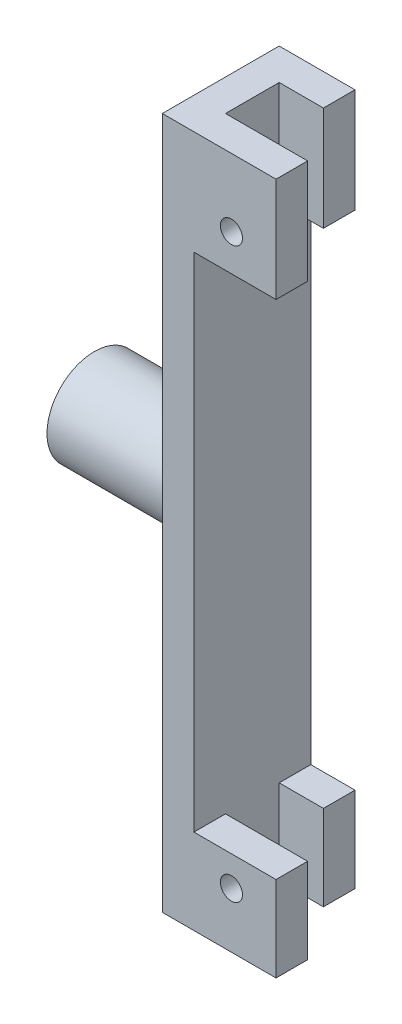
ISO-10303-21;
HEADER;
FILE_DESCRIPTION(('STEP AP214'),'2;1');
FILE_NAME('part.step','',(''),(''),'','','');
FILE_SCHEMA(('AUTOMOTIVE_DESIGN { 1 0 10303 214 1 1 1 1 }'));
ENDSEC;
DATA;
#1=APPLICATION_CONTEXT('core data for automotive mechanical design processes');
#2=APPLICATION_PROTOCOL_DEFINITION('international standard','automotive_design',2000,#1);
#3=PRODUCT_CONTEXT('',#1,'mechanical');
#4=PRODUCT('Part','Part','',(#3));
#5=PRODUCT_RELATED_PRODUCT_CATEGORY('part','',(#4));
#6=PRODUCT_DEFINITION_FORMATION('','',#4);
#7=PRODUCT_DEFINITION_CONTEXT('part definition',#1,'design');
#8=PRODUCT_DEFINITION('design','',#6,#7);
#9=PRODUCT_DEFINITION_SHAPE('','',#8);
#10=(LENGTH_UNIT() NAMED_UNIT(*) SI_UNIT(.MILLI.,.METRE.));
#11=(NAMED_UNIT(*) PLANE_ANGLE_UNIT() SI_UNIT($,.RADIAN.));
#12=(NAMED_UNIT(*) SI_UNIT($,.STERADIAN.) SOLID_ANGLE_UNIT());
#13=UNCERTAINTY_MEASURE_WITH_UNIT(LENGTH_MEASURE(1.E-05),#10,'distance_accuracy_value','');
#14=(GEOMETRIC_REPRESENTATION_CONTEXT(3) GLOBAL_UNCERTAINTY_ASSIGNED_CONTEXT((#13)) GLOBAL_UNIT_ASSIGNED_CONTEXT((#10,
#11,#12)) REPRESENTATION_CONTEXT('',''));
#15=CARTESIAN_POINT('',(0.,0.,0.));
#16=DIRECTION('',(0.,0.,1.));
#17=DIRECTION('',(1.,0.,0.));
#18=AXIS2_PLACEMENT_3D('',#15,#16,#17);
#19=CARTESIAN_POINT('',(-18.,-109.5,37.));
#20=DIRECTION('',(1.,0.,0.));
#21=DIRECTION('',(0.,0.,-1.));
#22=AXIS2_PLACEMENT_3D('',#19,#20,#21);
#23=PLANE('',#22);
#24=DIRECTION('',(0.,-1.,0.));
#25=VECTOR('',#24,1.);
#26=CARTESIAN_POINT('',(-18.,-109.5,0.));
#27=LINE('',#26,#25);
#28=CARTESIAN_POINT('',(-18.,109.5,0.));
#29=VERTEX_POINT('',#28);
#30=CARTESIAN_POINT('',(-18.,-109.5,0.));
#31=VERTEX_POINT('',#30);
#32=EDGE_CURVE('E171',#29,#31,#27,.T.);
#33=ORIENTED_EDGE('',*,*,#32,.T.);
#34=DIRECTION('',(0.,0.,-1.));
#35=VECTOR('',#34,1.);
#36=CARTESIAN_POINT('',(-18.,-109.5,37.));
#37=LINE('',#36,#35);
#38=CARTESIAN_POINT('',(-18.,-109.5,37.));
#39=VERTEX_POINT('',#38);
#40=EDGE_CURVE('E168',#39,#31,#37,.T.);
#41=ORIENTED_EDGE('',*,*,#40,.F.);
#42=DIRECTION('',(0.,-1.,0.));
#43=VECTOR('',#42,1.);
#44=CARTESIAN_POINT('',(-18.,-109.5,37.));
#45=LINE('',#44,#43);
#46=CARTESIAN_POINT('',(-18.,109.5,37.));
#47=VERTEX_POINT('',#46);
#48=EDGE_CURVE('E173',#47,#39,#45,.T.);
#49=ORIENTED_EDGE('',*,*,#48,.F.);
#50=DIRECTION('',(0.,0.,-1.));
#51=VECTOR('',#50,1.);
#52=CARTESIAN_POINT('',(-18.,109.5,37.));
#53=LINE('',#52,#51);
#54=EDGE_CURVE('E179',#47,#29,#53,.T.);
#55=ORIENTED_EDGE('',*,*,#54,.T.);
#56=EDGE_LOOP('',(#33,#41,#49,#55));
#57=FACE_BOUND('',#56,.T.);
#58=CARTESIAN_POINT('',(-18.,0.,18.5));
#59=DIRECTION('',(1.,0.,0.));
#60=DIRECTION('',(0.,0.,-1.));
#61=AXIS2_PLACEMENT_3D('',#58,#59,#60);
#62=CIRCLE('',#61,15.);
#63=CARTESIAN_POINT('',(-18.,0.,3.49999999999996));
#64=VERTEX_POINT('',#63);
#65=EDGE_CURVE('E11',#64,#64,#62,.F.);
#66=ORIENTED_EDGE('',*,*,#65,.F.);
#67=EDGE_LOOP('',(#66));
#68=FACE_BOUND('',#67,.T.);
#69=ADVANCED_FACE('F35',(#57,#68),#23,.F.);
#70=CARTESIAN_POINT('',(-7.99999999999997,-82.5,37.));
#71=DIRECTION('',(0.,1.,0.));
#72=DIRECTION('',(0.,0.,1.));
#73=AXIS2_PLACEMENT_3D('',#70,#71,#72);
#74=PLANE('',#73);
#75=DIRECTION('',(1.,0.,0.));
#76=VECTOR('',#75,1.);
#77=CARTESIAN_POINT('',(-7.99999999999997,-82.5,10.));
#78=LINE('',#77,#76);
#79=CARTESIAN_POINT('',(-7.99999999999997,-82.5,10.));
#80=VERTEX_POINT('',#79);
#81=CARTESIAN_POINT('',(6.00000000000003,-82.5,10.));
#82=VERTEX_POINT('',#81);
#83=EDGE_CURVE('E248',#80,#82,#78,.T.);
#84=ORIENTED_EDGE('',*,*,#83,.T.);
#85=DIRECTION('',(0.,0.,-1.));
#86=VECTOR('',#85,1.);
#87=CARTESIAN_POINT('',(6.00000000000003,-82.5,37.));
#88=LINE('',#87,#86);
#89=CARTESIAN_POINT('',(6.00000000000003,-82.5,0.));
#90=VERTEX_POINT('',#89);
#91=EDGE_CURVE('E57',#82,#90,#88,.T.);
#92=ORIENTED_EDGE('',*,*,#91,.T.);
#93=DIRECTION('',(1.,0.,0.));
#94=VECTOR('',#93,1.);
#95=CARTESIAN_POINT('',(-7.99999999999997,-82.5,0.));
#96=LINE('',#95,#94);
#97=CARTESIAN_POINT('',(-7.99999999999997,-82.5,0.));
#98=VERTEX_POINT('',#97);
#99=EDGE_CURVE('E163',#98,#90,#96,.T.);
#100=ORIENTED_EDGE('',*,*,#99,.F.);
#101=DIRECTION('',(0.,0.,-1.));
#102=VECTOR('',#101,1.);
#103=CARTESIAN_POINT('',(-7.99999999999997,-82.5,37.));
#104=LINE('',#103,#102);
#105=EDGE_CURVE('E268',#80,#98,#104,.T.);
#106=ORIENTED_EDGE('',*,*,#105,.F.);
#107=EDGE_LOOP('',(#84,#92,#100,#106));
#108=FACE_BOUND('',#107,.T.);
#109=ADVANCED_FACE('F309',(#108),#74,.T.);
#110=CARTESIAN_POINT('',(-7.99999999999999,76.5,37.));
#111=DIRECTION('',(0.,-1.,0.));
#112=DIRECTION('',(0.,0.,-1.));
#113=AXIS2_PLACEMENT_3D('',#110,#111,#112);
#114=PLANE('',#113);
#115=DIRECTION('',(1.,0.,0.));
#116=VECTOR('',#115,1.);
#117=CARTESIAN_POINT('',(0.,76.5,0.));
#118=LINE('',#117,#116);
#119=CARTESIAN_POINT('',(-7.99999999999999,76.5,0.));
#120=VERTEX_POINT('',#119);
#121=CARTESIAN_POINT('',(6.00000000000001,76.5,0.));
#122=VERTEX_POINT('',#121);
#123=EDGE_CURVE('E190',#120,#122,#118,.T.);
#124=ORIENTED_EDGE('',*,*,#123,.T.);
#125=DIRECTION('',(0.,0.,1.));
#126=VECTOR('',#125,1.);
#127=CARTESIAN_POINT('',(6.00000000000001,76.5,37.));
#128=LINE('',#127,#126);
#129=CARTESIAN_POINT('',(6.00000000000001,76.5,10.));
#130=VERTEX_POINT('',#129);
#131=EDGE_CURVE('E215',#122,#130,#128,.T.);
#132=ORIENTED_EDGE('',*,*,#131,.T.);
#133=DIRECTION('',(-1.,0.,0.));
#134=VECTOR('',#133,1.);
#135=CARTESIAN_POINT('',(-7.99999999999999,76.5,10.));
#136=LINE('',#135,#134);
#137=CARTESIAN_POINT('',(-7.99999999999999,76.5,10.));
#138=VERTEX_POINT('',#137);
#139=EDGE_CURVE('E246',#130,#138,#136,.T.);
#140=ORIENTED_EDGE('',*,*,#139,.T.);
#141=DIRECTION('',(0.,0.,-1.));
#142=VECTOR('',#141,1.);
#143=CARTESIAN_POINT('',(-7.99999999999999,76.5,37.));
#144=LINE('',#143,#142);
#145=EDGE_CURVE('E262',#138,#120,#144,.T.);
#146=ORIENTED_EDGE('',*,*,#145,.T.);
#147=EDGE_LOOP('',(#124,#132,#140,#146));
#148=FACE_BOUND('',#147,.T.);
#149=ADVANCED_FACE('F299',(#148),#114,.T.);
#150=CARTESIAN_POINT('',(0.,0.,0.));
#151=DIRECTION('',(0.,0.,1.));
#152=DIRECTION('',(1.,0.,0.));
#153=AXIS2_PLACEMENT_3D('',#150,#151,#152);
#154=PLANE('',#153);
#155=DIRECTION('',(0.,-1.,0.));
#156=VECTOR('',#155,1.);
#157=CARTESIAN_POINT('',(6.,126.5,0.));
#158=LINE('',#157,#156);
#159=CARTESIAN_POINT('',(6.00000000000003,-109.5,0.));
#160=VERTEX_POINT('',#159);
#161=EDGE_CURVE('E148',#90,#160,#158,.T.);
#162=ORIENTED_EDGE('',*,*,#161,.T.);
#163=DIRECTION('',(1.,0.,0.));
#164=VECTOR('',#163,1.);
#165=CARTESIAN_POINT('',(18.,-109.5,0.));
#166=LINE('',#165,#164);
#167=EDGE_CURVE('E159',#31,#160,#166,.T.);
#168=ORIENTED_EDGE('',*,*,#167,.F.);
#169=ORIENTED_EDGE('',*,*,#32,.F.);
#170=DIRECTION('',(-1.,0.,0.));
#171=VECTOR('',#170,1.);
#172=CARTESIAN_POINT('',(18.,109.5,0.));
#173=LINE('',#172,#171);
#174=CARTESIAN_POINT('',(6.,109.5,0.));
#175=VERTEX_POINT('',#174);
#176=EDGE_CURVE('E170',#175,#29,#173,.T.);
#177=ORIENTED_EDGE('',*,*,#176,.F.);
#178=EDGE_CURVE('E153',#175,#122,#158,.T.);
#179=ORIENTED_EDGE('',*,*,#178,.T.);
#180=ORIENTED_EDGE('',*,*,#123,.F.);
#181=DIRECTION('',(0.,-1.,0.));
#182=VECTOR('',#181,1.);
#183=CARTESIAN_POINT('',(-7.99999999999999,76.5,0.));
#184=LINE('',#183,#182);
#185=EDGE_CURVE('E255',#120,#98,#184,.T.);
#186=ORIENTED_EDGE('',*,*,#185,.T.);
#187=ORIENTED_EDGE('',*,*,#99,.T.);
#188=EDGE_LOOP('',(#162,#168,#169,#177,#179,#180,#186,#187));
#189=FACE_BOUND('',#188,.T.);
#190=ADVANCED_FACE('F157',(#189),#154,.F.);
#191=CARTESIAN_POINT('',(18.,-109.5,37.));
#192=DIRECTION('',(0.,1.,0.));
#193=DIRECTION('',(0.,0.,1.));
#194=AXIS2_PLACEMENT_3D('',#191,#192,#193);
#195=PLANE('',#194);
#196=DIRECTION('',(0.,0.,-1.));
#197=VECTOR('',#196,1.);
#198=CARTESIAN_POINT('',(6.00000000000003,-109.5,17.));
#199=LINE('',#198,#197);
#200=CARTESIAN_POINT('',(6.00000000000003,-109.5,10.));
#201=VERTEX_POINT('',#200);
#202=EDGE_CURVE('E145',#201,#160,#199,.T.);
#203=ORIENTED_EDGE('',*,*,#202,.F.);
#204=DIRECTION('',(1.,0.,0.));
#205=VECTOR('',#204,1.);
#206=CARTESIAN_POINT('',(-7.99999999999997,-109.5,10.));
#207=LINE('',#206,#205);
#208=CARTESIAN_POINT('',(-7.99999999999997,-109.5,10.));
#209=VERTEX_POINT('',#208);
#210=EDGE_CURVE('E237',#209,#201,#207,.T.);
#211=ORIENTED_EDGE('',*,*,#210,.F.);
#212=DIRECTION('',(0.,0.,-1.));
#213=VECTOR('',#212,1.);
#214=CARTESIAN_POINT('',(-7.99999999999997,-109.5,27.));
#215=LINE('',#214,#213);
#216=CARTESIAN_POINT('',(-7.99999999999997,-109.5,27.));
#217=VERTEX_POINT('',#216);
#218=EDGE_CURVE('E243',#217,#209,#215,.T.);
#219=ORIENTED_EDGE('',*,*,#218,.F.);
#220=DIRECTION('',(1.,0.,0.));
#221=VECTOR('',#220,1.);
#222=CARTESIAN_POINT('',(-7.99999999999997,-109.5,27.));
#223=LINE('',#222,#221);
#224=CARTESIAN_POINT('',(18.,-109.5,27.));
#225=VERTEX_POINT('',#224);
#226=EDGE_CURVE('E222',#217,#225,#223,.T.);
#227=ORIENTED_EDGE('',*,*,#226,.T.);
#228=DIRECTION('',(0.,0.,-1.));
#229=VECTOR('',#228,1.);
#230=CARTESIAN_POINT('',(18.,-109.5,37.));
#231=LINE('',#230,#229);
#232=CARTESIAN_POINT('',(18.,-109.5,37.));
#233=VERTEX_POINT('',#232);
#234=EDGE_CURVE('E186',#233,#225,#231,.T.);
#235=ORIENTED_EDGE('',*,*,#234,.F.);
#236=DIRECTION('',(1.,0.,0.));
#237=VECTOR('',#236,1.);
#238=CARTESIAN_POINT('',(18.,-109.5,37.));
#239=LINE('',#238,#237);
#240=EDGE_CURVE('E278',#39,#233,#239,.T.);
#241=ORIENTED_EDGE('',*,*,#240,.F.);
#242=ORIENTED_EDGE('',*,*,#40,.T.);
#243=ORIENTED_EDGE('',*,*,#167,.T.);
#244=EDGE_LOOP('',(#203,#211,#219,#227,#235,#241,#242,#243));
#245=FACE_BOUND('',#244,.T.);
#246=ADVANCED_FACE('F166',(#245),#195,.F.);
#247=CARTESIAN_POINT('',(18.,109.5,37.));
#248=DIRECTION('',(0.,-1.,0.));
#249=DIRECTION('',(0.,0.,-1.));
#250=AXIS2_PLACEMENT_3D('',#247,#248,#249);
#251=PLANE('',#250);
#252=DIRECTION('',(0.,0.,1.));
#253=VECTOR('',#252,1.);
#254=CARTESIAN_POINT('',(6.,109.5,37.));
#255=LINE('',#254,#253);
#256=CARTESIAN_POINT('',(6.,109.5,10.));
#257=VERTEX_POINT('',#256);
#258=EDGE_CURVE('E49',#175,#257,#255,.T.);
#259=ORIENTED_EDGE('',*,*,#258,.F.);
#260=ORIENTED_EDGE('',*,*,#176,.T.);
#261=ORIENTED_EDGE('',*,*,#54,.F.);
#262=DIRECTION('',(-1.,0.,0.));
#263=VECTOR('',#262,1.);
#264=CARTESIAN_POINT('',(18.,109.5,37.));
#265=LINE('',#264,#263);
#266=CARTESIAN_POINT('',(18.,109.5,37.));
#267=VERTEX_POINT('',#266);
#268=EDGE_CURVE('E183',#267,#47,#265,.T.);
#269=ORIENTED_EDGE('',*,*,#268,.F.);
#270=DIRECTION('',(0.,0.,-1.));
#271=VECTOR('',#270,1.);
#272=CARTESIAN_POINT('',(18.,109.5,37.));
#273=LINE('',#272,#271);
#274=CARTESIAN_POINT('',(18.,109.5,27.));
#275=VERTEX_POINT('',#274);
#276=EDGE_CURVE('E182',#267,#275,#273,.T.);
#277=ORIENTED_EDGE('',*,*,#276,.T.);
#278=DIRECTION('',(-1.,0.,0.));
#279=VECTOR('',#278,1.);
#280=CARTESIAN_POINT('',(-8.,109.5,27.));
#281=LINE('',#280,#279);
#282=CARTESIAN_POINT('',(-8.,109.5,27.));
#283=VERTEX_POINT('',#282);
#284=EDGE_CURVE('E230',#275,#283,#281,.T.);
#285=ORIENTED_EDGE('',*,*,#284,.T.);
#286=DIRECTION('',(0.,0.,-1.));
#287=VECTOR('',#286,1.);
#288=CARTESIAN_POINT('',(-8.,109.5,27.));
#289=LINE('',#288,#287);
#290=CARTESIAN_POINT('',(-8.,109.5,10.));
#291=VERTEX_POINT('',#290);
#292=EDGE_CURVE('E233',#283,#291,#289,.T.);
#293=ORIENTED_EDGE('',*,*,#292,.T.);
#294=DIRECTION('',(-1.,0.,0.));
#295=VECTOR('',#294,1.);
#296=CARTESIAN_POINT('',(-8.,109.5,10.));
#297=LINE('',#296,#295);
#298=EDGE_CURVE('E239',#257,#291,#297,.T.);
#299=ORIENTED_EDGE('',*,*,#298,.F.);
#300=EDGE_LOOP('',(#259,#260,#261,#269,#277,#285,#293,#299));
#301=FACE_BOUND('',#300,.T.);
#302=ADVANCED_FACE('F292',(#301),#251,.F.);
#303=CARTESIAN_POINT('',(0.,0.,10.));
#304=DIRECTION('',(0.,0.,1.));
#305=DIRECTION('',(1.,0.,0.));
#306=AXIS2_PLACEMENT_3D('',#303,#304,#305);
#307=PLANE('',#306);
#308=ORIENTED_EDGE('',*,*,#139,.F.);
#309=DIRECTION('',(0.,1.,0.));
#310=VECTOR('',#309,1.);
#311=CARTESIAN_POINT('',(6.00000000000002,0.,10.));
#312=LINE('',#311,#310);
#313=EDGE_CURVE('E212',#130,#257,#312,.T.);
#314=ORIENTED_EDGE('',*,*,#313,.T.);
#315=ORIENTED_EDGE('',*,*,#298,.T.);
#316=DIRECTION('',(0.,-1.,0.));
#317=VECTOR('',#316,1.);
#318=CARTESIAN_POINT('',(-8.,109.5,10.));
#319=LINE('',#318,#317);
#320=EDGE_CURVE('E234',#291,#138,#319,.T.);
#321=ORIENTED_EDGE('',*,*,#320,.T.);
#322=EDGE_LOOP('',(#308,#314,#315,#321));
#323=FACE_BOUND('',#322,.T.);
#324=ADVANCED_FACE('F374',(#323),#307,.T.);
#325=ORIENTED_EDGE('',*,*,#210,.T.);
#326=DIRECTION('',(0.,1.,0.));
#327=VECTOR('',#326,1.);
#328=CARTESIAN_POINT('',(6.00000000000002,0.,10.));
#329=LINE('',#328,#327);
#330=EDGE_CURVE('E42',#201,#82,#329,.T.);
#331=ORIENTED_EDGE('',*,*,#330,.T.);
#332=ORIENTED_EDGE('',*,*,#83,.F.);
#333=EDGE_CURVE('E218',#80,#209,#319,.T.);
#334=ORIENTED_EDGE('',*,*,#333,.T.);
#335=EDGE_LOOP('',(#325,#331,#332,#334));
#336=FACE_BOUND('',#335,.T.);
#337=ADVANCED_FACE('F311',(#336),#307,.T.);
#338=CARTESIAN_POINT('',(18.,-109.5,37.));
#339=DIRECTION('',(-1.,0.,0.));
#340=DIRECTION('',(0.,0.,1.));
#341=AXIS2_PLACEMENT_3D('',#338,#339,#340);
#342=PLANE('',#341);
#343=ORIENTED_EDGE('',*,*,#234,.T.);
#344=DIRECTION('',(0.,1.,0.));
#345=VECTOR('',#344,1.);
#346=CARTESIAN_POINT('',(18.,109.5,27.));
#347=LINE('',#346,#345);
#348=CARTESIAN_POINT('',(18.,-82.5,27.));
#349=VERTEX_POINT('',#348);
#350=EDGE_CURVE('E227',#225,#349,#347,.T.);
#351=ORIENTED_EDGE('',*,*,#350,.T.);
#352=DIRECTION('',(0.,0.,-1.));
#353=VECTOR('',#352,1.);
#354=CARTESIAN_POINT('',(18.,-82.5,37.));
#355=LINE('',#354,#353);
#356=CARTESIAN_POINT('',(18.,-82.5,37.));
#357=VERTEX_POINT('',#356);
#358=EDGE_CURVE('E175',#357,#349,#355,.T.);
#359=ORIENTED_EDGE('',*,*,#358,.F.);
#360=DIRECTION('',(0.,1.,0.));
#361=VECTOR('',#360,1.);
#362=CARTESIAN_POINT('',(18.,-109.5,37.));
#363=LINE('',#362,#361);
#364=EDGE_CURVE('E281',#233,#357,#363,.T.);
#365=ORIENTED_EDGE('',*,*,#364,.F.);
#366=EDGE_LOOP('',(#343,#351,#359,#365));
#367=FACE_BOUND('',#366,.T.);
#368=ADVANCED_FACE('F321',(#367),#342,.F.);
#369=DIRECTION('',(0.,0.,1.));
#370=VECTOR('',#369,1.);
#371=CARTESIAN_POINT('',(18.,76.5,37.));
#372=LINE('',#371,#370);
#373=CARTESIAN_POINT('',(18.,76.5,27.));
#374=VERTEX_POINT('',#373);
#375=CARTESIAN_POINT('',(18.,76.5,37.));
#376=VERTEX_POINT('',#375);
#377=EDGE_CURVE('E272',#374,#376,#372,.T.);
#378=ORIENTED_EDGE('',*,*,#377,.F.);
#379=EDGE_CURVE('E226',#374,#275,#347,.T.);
#380=ORIENTED_EDGE('',*,*,#379,.T.);
#381=ORIENTED_EDGE('',*,*,#276,.F.);
#382=EDGE_CURVE('E280',#376,#267,#363,.T.);
#383=ORIENTED_EDGE('',*,*,#382,.F.);
#384=EDGE_LOOP('',(#378,#380,#381,#383));
#385=FACE_BOUND('',#384,.T.);
#386=ADVANCED_FACE('F335',(#385),#342,.F.);
#387=CARTESIAN_POINT('',(0.,0.,37.));
#388=DIRECTION('',(0.,0.,1.));
#389=DIRECTION('',(1.,0.,0.));
#390=AXIS2_PLACEMENT_3D('',#387,#388,#389);
#391=PLANE('',#390);
#392=CARTESIAN_POINT('',(3.87816962595056,-92.,37.));
#393=DIRECTION('',(0.,0.,1.));
#394=DIRECTION('',(1.,0.,0.));
#395=AXIS2_PLACEMENT_3D('',#392,#393,#394);
#396=CIRCLE('',#395,3.5);
#397=CARTESIAN_POINT('',(7.37816962595056,-92.,37.));
#398=VERTEX_POINT('',#397);
#399=EDGE_CURVE('E198',#398,#398,#396,.T.);
#400=ORIENTED_EDGE('',*,*,#399,.F.);
#401=EDGE_LOOP('',(#400));
#402=FACE_BOUND('',#401,.T.);
#403=CARTESIAN_POINT('',(3.87816962595056,88.,37.));
#404=DIRECTION('',(0.,0.,1.));
#405=DIRECTION('',(1.,0.,0.));
#406=AXIS2_PLACEMENT_3D('',#403,#404,#405);
#407=CIRCLE('',#406,3.5);
#408=CARTESIAN_POINT('',(7.37816962595056,88.,37.));
#409=VERTEX_POINT('',#408);
#410=EDGE_CURVE('E195',#409,#409,#407,.T.);
#411=ORIENTED_EDGE('',*,*,#410,.F.);
#412=EDGE_LOOP('',(#411));
#413=FACE_BOUND('',#412,.T.);
#414=ORIENTED_EDGE('',*,*,#364,.T.);
#415=DIRECTION('',(1.,0.,0.));
#416=VECTOR('',#415,1.);
#417=CARTESIAN_POINT('',(-7.99999999999997,-82.5,37.));
#418=LINE('',#417,#416);
#419=CARTESIAN_POINT('',(-7.99999999999997,-82.5,37.));
#420=VERTEX_POINT('',#419);
#421=EDGE_CURVE('E258',#420,#357,#418,.T.);
#422=ORIENTED_EDGE('',*,*,#421,.F.);
#423=DIRECTION('',(0.,-1.,0.));
#424=VECTOR('',#423,1.);
#425=CARTESIAN_POINT('',(-7.99999999999999,76.5,37.));
#426=LINE('',#425,#424);
#427=CARTESIAN_POINT('',(-7.99999999999999,76.5,37.));
#428=VERTEX_POINT('',#427);
#429=EDGE_CURVE('E256',#428,#420,#426,.T.);
#430=ORIENTED_EDGE('',*,*,#429,.F.);
#431=DIRECTION('',(-1.,0.,0.));
#432=VECTOR('',#431,1.);
#433=CARTESIAN_POINT('',(-7.99999999999999,76.5,37.));
#434=LINE('',#433,#432);
#435=EDGE_CURVE('E260',#376,#428,#434,.T.);
#436=ORIENTED_EDGE('',*,*,#435,.F.);
#437=ORIENTED_EDGE('',*,*,#382,.T.);
#438=ORIENTED_EDGE('',*,*,#268,.T.);
#439=ORIENTED_EDGE('',*,*,#48,.T.);
#440=ORIENTED_EDGE('',*,*,#240,.T.);
#441=EDGE_LOOP('',(#414,#422,#430,#436,#437,#438,#439,#440));
#442=FACE_BOUND('',#441,.T.);
#443=ADVANCED_FACE('F286',(#402,#413,#442),#391,.T.);
#444=DIRECTION('',(1.,0.,0.));
#445=VECTOR('',#444,1.);
#446=CARTESIAN_POINT('',(-7.99999999999997,-82.5,27.));
#447=LINE('',#446,#445);
#448=CARTESIAN_POINT('',(-7.99999999999997,-82.5,27.));
#449=VERTEX_POINT('',#448);
#450=EDGE_CURVE('E253',#449,#349,#447,.T.);
#451=ORIENTED_EDGE('',*,*,#450,.F.);
#452=EDGE_CURVE('E269',#420,#449,#104,.T.);
#453=ORIENTED_EDGE('',*,*,#452,.F.);
#454=ORIENTED_EDGE('',*,*,#421,.T.);
#455=ORIENTED_EDGE('',*,*,#358,.T.);
#456=EDGE_LOOP('',(#451,#453,#454,#455));
#457=FACE_BOUND('',#456,.T.);
#458=ADVANCED_FACE('F324',(#457),#74,.T.);
#459=DIRECTION('',(-1.,0.,0.));
#460=VECTOR('',#459,1.);
#461=CARTESIAN_POINT('',(-7.99999999999999,76.5,27.));
#462=LINE('',#461,#460);
#463=CARTESIAN_POINT('',(-7.99999999999999,76.5,27.));
#464=VERTEX_POINT('',#463);
#465=EDGE_CURVE('E251',#374,#464,#462,.T.);
#466=ORIENTED_EDGE('',*,*,#465,.F.);
#467=ORIENTED_EDGE('',*,*,#377,.T.);
#468=ORIENTED_EDGE('',*,*,#435,.T.);
#469=EDGE_CURVE('E265',#428,#464,#144,.T.);
#470=ORIENTED_EDGE('',*,*,#469,.T.);
#471=EDGE_LOOP('',(#466,#467,#468,#470));
#472=FACE_BOUND('',#471,.T.);
#473=ADVANCED_FACE('F331',(#472),#114,.T.);
#474=CARTESIAN_POINT('',(-7.99999999999999,76.5,37.));
#475=DIRECTION('',(1.,0.,0.));
#476=DIRECTION('',(0.,1.,0.));
#477=AXIS2_PLACEMENT_3D('',#474,#475,#476);
#478=PLANE('',#477);
#479=ORIENTED_EDGE('',*,*,#452,.T.);
#480=DIRECTION('',(0.,-1.,0.));
#481=VECTOR('',#480,1.);
#482=CARTESIAN_POINT('',(-8.,109.5,27.));
#483=LINE('',#482,#481);
#484=EDGE_CURVE('E223',#449,#217,#483,.T.);
#485=ORIENTED_EDGE('',*,*,#484,.T.);
#486=ORIENTED_EDGE('',*,*,#218,.T.);
#487=ORIENTED_EDGE('',*,*,#333,.F.);
#488=ORIENTED_EDGE('',*,*,#105,.T.);
#489=ORIENTED_EDGE('',*,*,#185,.F.);
#490=ORIENTED_EDGE('',*,*,#145,.F.);
#491=ORIENTED_EDGE('',*,*,#320,.F.);
#492=ORIENTED_EDGE('',*,*,#292,.F.);
#493=EDGE_CURVE('E219',#283,#464,#483,.T.);
#494=ORIENTED_EDGE('',*,*,#493,.T.);
#495=ORIENTED_EDGE('',*,*,#469,.F.);
#496=ORIENTED_EDGE('',*,*,#429,.T.);
#497=EDGE_LOOP('',(#479,#485,#486,#487,#488,#489,#490,#491,#492,#494,#495,#496));
#498=FACE_BOUND('',#497,.T.);
#499=ADVANCED_FACE('F305',(#498),#478,.T.);
#500=CARTESIAN_POINT('',(0.,0.,27.));
#501=DIRECTION('',(0.,0.,1.));
#502=DIRECTION('',(1.,0.,0.));
#503=AXIS2_PLACEMENT_3D('',#500,#501,#502);
#504=PLANE('',#503);
#505=CARTESIAN_POINT('',(3.87816962595056,88.,27.));
#506=DIRECTION('',(0.,0.,1.));
#507=DIRECTION('',(1.,0.,0.));
#508=AXIS2_PLACEMENT_3D('',#505,#506,#507);
#509=CIRCLE('',#508,3.5);
#510=CARTESIAN_POINT('',(7.37816962595056,88.,27.));
#511=VERTEX_POINT('',#510);
#512=EDGE_CURVE('E164',#511,#511,#509,.T.);
#513=ORIENTED_EDGE('',*,*,#512,.T.);
#514=EDGE_LOOP('',(#513));
#515=FACE_BOUND('',#514,.T.);
#516=ORIENTED_EDGE('',*,*,#465,.T.);
#517=ORIENTED_EDGE('',*,*,#493,.F.);
#518=ORIENTED_EDGE('',*,*,#284,.F.);
#519=ORIENTED_EDGE('',*,*,#379,.F.);
#520=EDGE_LOOP('',(#516,#517,#518,#519));
#521=FACE_BOUND('',#520,.T.);
#522=ADVANCED_FACE('F338',(#515,#521),#504,.F.);
#523=CARTESIAN_POINT('',(3.87816962595056,-92.,27.));
#524=DIRECTION('',(0.,0.,1.));
#525=DIRECTION('',(1.,0.,0.));
#526=AXIS2_PLACEMENT_3D('',#523,#524,#525);
#527=CIRCLE('',#526,3.5);
#528=CARTESIAN_POINT('',(7.37816962595056,-92.,27.));
#529=VERTEX_POINT('',#528);
#530=EDGE_CURVE('E196',#529,#529,#527,.T.);
#531=ORIENTED_EDGE('',*,*,#530,.T.);
#532=EDGE_LOOP('',(#531));
#533=FACE_BOUND('',#532,.T.);
#534=ORIENTED_EDGE('',*,*,#450,.T.);
#535=ORIENTED_EDGE('',*,*,#350,.F.);
#536=ORIENTED_EDGE('',*,*,#226,.F.);
#537=ORIENTED_EDGE('',*,*,#484,.F.);
#538=EDGE_LOOP('',(#534,#535,#536,#537));
#539=FACE_BOUND('',#538,.T.);
#540=ADVANCED_FACE('F318',(#533,#539),#504,.F.);
#541=CARTESIAN_POINT('',(6.,126.5,17.));
#542=DIRECTION('',(1.,0.,0.));
#543=DIRECTION('',(0.,1.,0.));
#544=AXIS2_PLACEMENT_3D('',#541,#542,#543);
#545=PLANE('',#544);
#546=ORIENTED_EDGE('',*,*,#330,.F.);
#547=ORIENTED_EDGE('',*,*,#202,.T.);
#548=ORIENTED_EDGE('',*,*,#161,.F.);
#549=ORIENTED_EDGE('',*,*,#91,.F.);
#550=EDGE_LOOP('',(#546,#547,#548,#549));
#551=FACE_BOUND('',#550,.T.);
#552=ADVANCED_FACE('F147',(#551),#545,.T.);
#553=ORIENTED_EDGE('',*,*,#178,.F.);
#554=ORIENTED_EDGE('',*,*,#258,.T.);
#555=ORIENTED_EDGE('',*,*,#313,.F.);
#556=ORIENTED_EDGE('',*,*,#131,.F.);
#557=EDGE_LOOP('',(#553,#554,#555,#556));
#558=FACE_BOUND('',#557,.T.);
#559=ADVANCED_FACE('F464',(#558),#545,.T.);
#560=CARTESIAN_POINT('',(3.87816962595056,88.,20.));
#561=DIRECTION('',(0.,0.,1.));
#562=DIRECTION('',(1.,0.,0.));
#563=AXIS2_PLACEMENT_3D('',#560,#561,#562);
#564=CYLINDRICAL_SURFACE('',#563,3.5);
#565=ORIENTED_EDGE('',*,*,#410,.T.);
#566=EDGE_LOOP('',(#565));
#567=FACE_BOUND('',#566,.T.);
#568=ORIENTED_EDGE('',*,*,#512,.F.);
#569=EDGE_LOOP('',(#568));
#570=FACE_BOUND('',#569,.T.);
#571=ADVANCED_FACE('F468',(#567,#570),#564,.F.);
#572=CARTESIAN_POINT('',(3.87816962595056,-92.,20.));
#573=DIRECTION('',(0.,0.,1.));
#574=DIRECTION('',(1.,0.,0.));
#575=AXIS2_PLACEMENT_3D('',#572,#573,#574);
#576=CYLINDRICAL_SURFACE('',#575,3.5);
#577=ORIENTED_EDGE('',*,*,#399,.T.);
#578=EDGE_LOOP('',(#577));
#579=FACE_BOUND('',#578,.T.);
#580=ORIENTED_EDGE('',*,*,#530,.F.);
#581=EDGE_LOOP('',(#580));
#582=FACE_BOUND('',#581,.T.);
#583=ADVANCED_FACE('F482',(#579,#582),#576,.F.);
#584=CARTESIAN_POINT('',(-58.,0.,18.5));
#585=DIRECTION('',(1.,0.,0.));
#586=DIRECTION('',(0.,0.,-1.));
#587=AXIS2_PLACEMENT_3D('',#584,#585,#586);
#588=CYLINDRICAL_SURFACE('',#587,15.);
#589=CARTESIAN_POINT('',(-58.,0.,18.5));
#590=DIRECTION('',(-1.,0.,0.));
#591=DIRECTION('',(0.,0.,1.));
#592=AXIS2_PLACEMENT_3D('',#589,#590,#591);
#593=CIRCLE('',#592,15.);
#594=CARTESIAN_POINT('',(-58.,0.,33.5));
#595=VERTEX_POINT('',#594);
#596=EDGE_CURVE('E204',#595,#595,#593,.T.);
#597=ORIENTED_EDGE('',*,*,#596,.F.);
#598=EDGE_LOOP('',(#597));
#599=FACE_BOUND('',#598,.T.);
#600=ORIENTED_EDGE('',*,*,#65,.T.);
#601=EDGE_LOOP('',(#600));
#602=FACE_BOUND('',#601,.T.);
#603=ADVANCED_FACE('F486',(#599,#602),#588,.T.);
#604=CARTESIAN_POINT('',(-58.,0.,18.5));
#605=DIRECTION('',(-1.,0.,0.));
#606=DIRECTION('',(0.,0.,1.));
#607=AXIS2_PLACEMENT_3D('',#604,#605,#606);
#608=PLANE('',#607);
#609=ORIENTED_EDGE('',*,*,#596,.T.);
#610=EDGE_LOOP('',(#609));
#611=FACE_BOUND('',#610,.T.);
#612=ADVANCED_FACE('F489',(#611),#608,.T.);
#613=CLOSED_SHELL('',(#69,#109,#149,#190,#246,#302,#324,#337,#368,#386,#443,#458,#473,#499,#522,
#540,#552,#559,#571,#583,#603,#612));
#614=MANIFOLD_SOLID_BREP('B2',#613);
#615=ADVANCED_BREP_SHAPE_REPRESENTATION('',(#18,#614),#14);
#616=SHAPE_DEFINITION_REPRESENTATION(#9,#615);
ENDSEC;
END-ISO-10303-21;
